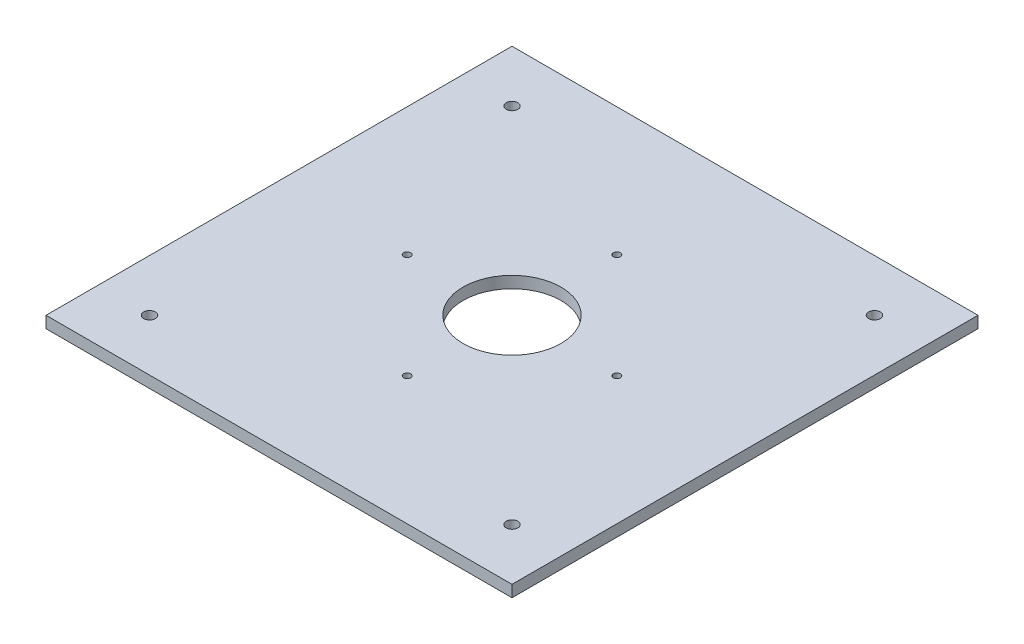
ISO-10303-21;
HEADER;
FILE_DESCRIPTION(('STEP AP214'),'2;1');
FILE_NAME('part.step','',(''),(''),'','','');
FILE_SCHEMA(('AUTOMOTIVE_DESIGN { 1 0 10303 214 1 1 1 1 }'));
ENDSEC;
DATA;
#1=APPLICATION_CONTEXT('core data for automotive mechanical design processes');
#2=APPLICATION_PROTOCOL_DEFINITION('international standard','automotive_design',2000,#1);
#3=PRODUCT_CONTEXT('',#1,'mechanical');
#4=PRODUCT('Part','Part','',(#3));
#5=PRODUCT_RELATED_PRODUCT_CATEGORY('part','',(#4));
#6=PRODUCT_DEFINITION_FORMATION('','',#4);
#7=PRODUCT_DEFINITION_CONTEXT('part definition',#1,'design');
#8=PRODUCT_DEFINITION('design','',#6,#7);
#9=PRODUCT_DEFINITION_SHAPE('','',#8);
#10=(LENGTH_UNIT() NAMED_UNIT(*) SI_UNIT(.MILLI.,.METRE.));
#11=(NAMED_UNIT(*) PLANE_ANGLE_UNIT() SI_UNIT($,.RADIAN.));
#12=(NAMED_UNIT(*) SI_UNIT($,.STERADIAN.) SOLID_ANGLE_UNIT());
#13=UNCERTAINTY_MEASURE_WITH_UNIT(LENGTH_MEASURE(1.E-05),#10,'distance_accuracy_value','');
#14=(GEOMETRIC_REPRESENTATION_CONTEXT(3) GLOBAL_UNCERTAINTY_ASSIGNED_CONTEXT((#13)) GLOBAL_UNIT_ASSIGNED_CONTEXT((#10,
#11,#12)) REPRESENTATION_CONTEXT('',''));
#15=CARTESIAN_POINT('',(0.,0.,0.));
#16=DIRECTION('',(0.,0.,1.));
#17=DIRECTION('',(1.,0.,0.));
#18=AXIS2_PLACEMENT_3D('',#15,#16,#17);
#19=CARTESIAN_POINT('',(99.9999999999999,5.,-100.));
#20=DIRECTION('',(-1.,0.,0.));
#21=DIRECTION('',(0.,0.,1.));
#22=AXIS2_PLACEMENT_3D('',#19,#20,#21);
#23=PLANE('',#22);
#24=DIRECTION('',(0.,0.,-1.));
#25=VECTOR('',#24,1.);
#26=CARTESIAN_POINT('',(99.9999999999999,0.,-100.));
#27=LINE('',#26,#25);
#28=CARTESIAN_POINT('',(100.,0.,100.));
#29=VERTEX_POINT('',#28);
#30=CARTESIAN_POINT('',(99.9999999999999,0.,-100.));
#31=VERTEX_POINT('',#30);
#32=EDGE_CURVE('E111',#29,#31,#27,.T.);
#33=ORIENTED_EDGE('',*,*,#32,.T.);
#34=DIRECTION('',(0.,-1.,0.));
#35=VECTOR('',#34,1.);
#36=CARTESIAN_POINT('',(99.9999999999999,5.,-100.));
#37=LINE('',#36,#35);
#38=CARTESIAN_POINT('',(99.9999999999999,5.,-100.));
#39=VERTEX_POINT('',#38);
#40=EDGE_CURVE('E11',#39,#31,#37,.T.);
#41=ORIENTED_EDGE('',*,*,#40,.F.);
#42=DIRECTION('',(0.,0.,-1.));
#43=VECTOR('',#42,1.);
#44=CARTESIAN_POINT('',(99.9999999999999,5.,-100.));
#45=LINE('',#44,#43);
#46=CARTESIAN_POINT('',(100.,5.,100.));
#47=VERTEX_POINT('',#46);
#48=EDGE_CURVE('E93',#47,#39,#45,.T.);
#49=ORIENTED_EDGE('',*,*,#48,.F.);
#50=DIRECTION('',(0.,-1.,0.));
#51=VECTOR('',#50,1.);
#52=CARTESIAN_POINT('',(100.,5.,100.));
#53=LINE('',#52,#51);
#54=EDGE_CURVE('E107',#47,#29,#53,.T.);
#55=ORIENTED_EDGE('',*,*,#54,.T.);
#56=EDGE_LOOP('',(#33,#41,#49,#55));
#57=FACE_BOUND('',#56,.T.);
#58=ADVANCED_FACE('F40',(#57),#23,.F.);
#59=CARTESIAN_POINT('',(-100.,5.,-100.));
#60=DIRECTION('',(0.,0.,1.));
#61=DIRECTION('',(1.,0.,0.));
#62=AXIS2_PLACEMENT_3D('',#59,#60,#61);
#63=PLANE('',#62);
#64=DIRECTION('',(-1.,0.,0.));
#65=VECTOR('',#64,1.);
#66=CARTESIAN_POINT('',(-100.,0.,-100.));
#67=LINE('',#66,#65);
#68=CARTESIAN_POINT('',(-100.,0.,-100.));
#69=VERTEX_POINT('',#68);
#70=EDGE_CURVE('E98',#31,#69,#67,.T.);
#71=ORIENTED_EDGE('',*,*,#70,.T.);
#72=DIRECTION('',(0.,-1.,0.));
#73=VECTOR('',#72,1.);
#74=CARTESIAN_POINT('',(-100.,5.,-100.));
#75=LINE('',#74,#73);
#76=CARTESIAN_POINT('',(-100.,5.,-100.));
#77=VERTEX_POINT('',#76);
#78=EDGE_CURVE('E50',#77,#69,#75,.T.);
#79=ORIENTED_EDGE('',*,*,#78,.F.);
#80=DIRECTION('',(-1.,0.,0.));
#81=VECTOR('',#80,1.);
#82=CARTESIAN_POINT('',(-100.,5.,-100.));
#83=LINE('',#82,#81);
#84=EDGE_CURVE('E88',#39,#77,#83,.T.);
#85=ORIENTED_EDGE('',*,*,#84,.F.);
#86=ORIENTED_EDGE('',*,*,#40,.T.);
#87=EDGE_LOOP('',(#71,#79,#85,#86));
#88=FACE_BOUND('',#87,.T.);
#89=ADVANCED_FACE('F97',(#88),#63,.F.);
#90=CARTESIAN_POINT('',(-100.,5.,-100.));
#91=DIRECTION('',(1.,0.,0.));
#92=DIRECTION('',(0.,0.,-1.));
#93=AXIS2_PLACEMENT_3D('',#90,#91,#92);
#94=PLANE('',#93);
#95=DIRECTION('',(0.,0.,1.));
#96=VECTOR('',#95,1.);
#97=CARTESIAN_POINT('',(-100.,0.,-100.));
#98=LINE('',#97,#96);
#99=CARTESIAN_POINT('',(-100.,0.,100.));
#100=VERTEX_POINT('',#99);
#101=EDGE_CURVE('E75',#69,#100,#98,.T.);
#102=ORIENTED_EDGE('',*,*,#101,.T.);
#103=DIRECTION('',(0.,-1.,0.));
#104=VECTOR('',#103,1.);
#105=CARTESIAN_POINT('',(-100.,5.,100.));
#106=LINE('',#105,#104);
#107=CARTESIAN_POINT('',(-100.,5.,100.));
#108=VERTEX_POINT('',#107);
#109=EDGE_CURVE('E100',#108,#100,#106,.T.);
#110=ORIENTED_EDGE('',*,*,#109,.F.);
#111=DIRECTION('',(0.,0.,1.));
#112=VECTOR('',#111,1.);
#113=CARTESIAN_POINT('',(-100.,5.,-100.));
#114=LINE('',#113,#112);
#115=EDGE_CURVE('E91',#77,#108,#114,.T.);
#116=ORIENTED_EDGE('',*,*,#115,.F.);
#117=ORIENTED_EDGE('',*,*,#78,.T.);
#118=EDGE_LOOP('',(#102,#110,#116,#117));
#119=FACE_BOUND('',#118,.T.);
#120=ADVANCED_FACE('F102',(#119),#94,.F.);
#121=CARTESIAN_POINT('',(-100.,5.,100.));
#122=DIRECTION('',(0.,0.,-1.));
#123=DIRECTION('',(-1.,0.,0.));
#124=AXIS2_PLACEMENT_3D('',#121,#122,#123);
#125=PLANE('',#124);
#126=DIRECTION('',(1.,0.,0.));
#127=VECTOR('',#126,1.);
#128=CARTESIAN_POINT('',(-100.,0.,100.));
#129=LINE('',#128,#127);
#130=EDGE_CURVE('E81',#100,#29,#129,.T.);
#131=ORIENTED_EDGE('',*,*,#130,.T.);
#132=ORIENTED_EDGE('',*,*,#54,.F.);
#133=DIRECTION('',(1.,0.,0.));
#134=VECTOR('',#133,1.);
#135=CARTESIAN_POINT('',(-100.,5.,100.));
#136=LINE('',#135,#134);
#137=EDGE_CURVE('E58',#108,#47,#136,.T.);
#138=ORIENTED_EDGE('',*,*,#137,.F.);
#139=ORIENTED_EDGE('',*,*,#109,.T.);
#140=EDGE_LOOP('',(#131,#132,#138,#139));
#141=FACE_BOUND('',#140,.T.);
#142=ADVANCED_FACE('F126',(#141),#125,.F.);
#143=CARTESIAN_POINT('',(0.,5.,0.));
#144=DIRECTION('',(0.,1.,0.));
#145=DIRECTION('',(0.,0.,1.));
#146=AXIS2_PLACEMENT_3D('',#143,#144,#145);
#147=PLANE('',#146);
#148=CARTESIAN_POINT('',(0.,5.,0.));
#149=DIRECTION('',(0.,1.,0.));
#150=DIRECTION('',(0.,0.,1.));
#151=AXIS2_PLACEMENT_3D('',#148,#149,#150);
#152=CIRCLE('',#151,21.);
#153=CARTESIAN_POINT('',(0.,5.,21.));
#154=VERTEX_POINT('',#153);
#155=EDGE_CURVE('E197',#154,#154,#152,.T.);
#156=ORIENTED_EDGE('',*,*,#155,.F.);
#157=EDGE_LOOP('',(#156));
#158=FACE_BOUND('',#157,.T.);
#159=CARTESIAN_POINT('',(0.,5.,45.));
#160=DIRECTION('',(0.,1.,0.));
#161=DIRECTION('',(0.,0.,1.));
#162=AXIS2_PLACEMENT_3D('',#159,#160,#161);
#163=CIRCLE('',#162,1.5);
#164=CARTESIAN_POINT('',(0.,5.,46.5));
#165=VERTEX_POINT('',#164);
#166=EDGE_CURVE('E190',#165,#165,#163,.T.);
#167=ORIENTED_EDGE('',*,*,#166,.F.);
#168=EDGE_LOOP('',(#167));
#169=FACE_BOUND('',#168,.T.);
#170=CARTESIAN_POINT('',(-45.,5.,0.));
#171=DIRECTION('',(0.,1.,0.));
#172=DIRECTION('',(0.,0.,1.));
#173=AXIS2_PLACEMENT_3D('',#170,#171,#172);
#174=CIRCLE('',#173,1.5);
#175=CARTESIAN_POINT('',(-45.,5.,1.5));
#176=VERTEX_POINT('',#175);
#177=EDGE_CURVE('E182',#176,#176,#174,.T.);
#178=ORIENTED_EDGE('',*,*,#177,.F.);
#179=EDGE_LOOP('',(#178));
#180=FACE_BOUND('',#179,.T.);
#181=CARTESIAN_POINT('',(0.,5.,-45.));
#182=DIRECTION('',(0.,1.,0.));
#183=DIRECTION('',(0.,0.,1.));
#184=AXIS2_PLACEMENT_3D('',#181,#182,#183);
#185=CIRCLE('',#184,1.5);
#186=CARTESIAN_POINT('',(0.,5.,-43.5));
#187=VERTEX_POINT('',#186);
#188=EDGE_CURVE('E174',#187,#187,#185,.T.);
#189=ORIENTED_EDGE('',*,*,#188,.F.);
#190=EDGE_LOOP('',(#189));
#191=FACE_BOUND('',#190,.T.);
#192=CARTESIAN_POINT('',(45.,5.,0.));
#193=DIRECTION('',(0.,1.,0.));
#194=DIRECTION('',(0.,0.,1.));
#195=AXIS2_PLACEMENT_3D('',#192,#193,#194);
#196=CIRCLE('',#195,1.5);
#197=CARTESIAN_POINT('',(45.,5.,1.5));
#198=VERTEX_POINT('',#197);
#199=EDGE_CURVE('E166',#198,#198,#196,.T.);
#200=ORIENTED_EDGE('',*,*,#199,.F.);
#201=EDGE_LOOP('',(#200));
#202=FACE_BOUND('',#201,.T.);
#203=CARTESIAN_POINT('',(-77.7817459305203,5.,-77.7817459305181));
#204=DIRECTION('',(0.,1.,0.));
#205=DIRECTION('',(0.,0.,1.));
#206=AXIS2_PLACEMENT_3D('',#203,#204,#205);
#207=CIRCLE('',#206,2.50000000000001);
#208=CARTESIAN_POINT('',(-77.7817459305203,5.,-75.2817459305181));
#209=VERTEX_POINT('',#208);
#210=EDGE_CURVE('E142',#209,#209,#207,.T.);
#211=ORIENTED_EDGE('',*,*,#210,.F.);
#212=EDGE_LOOP('',(#211));
#213=FACE_BOUND('',#212,.T.);
#214=CARTESIAN_POINT('',(-77.7817459305181,5.,77.7817459305224));
#215=DIRECTION('',(0.,1.,0.));
#216=DIRECTION('',(0.,0.,1.));
#217=AXIS2_PLACEMENT_3D('',#214,#215,#216);
#218=CIRCLE('',#217,2.5);
#219=CARTESIAN_POINT('',(-77.7817459305181,5.,80.2817459305224));
#220=VERTEX_POINT('',#219);
#221=EDGE_CURVE('E151',#220,#220,#218,.T.);
#222=ORIENTED_EDGE('',*,*,#221,.F.);
#223=EDGE_LOOP('',(#222));
#224=FACE_BOUND('',#223,.T.);
#225=CARTESIAN_POINT('',(77.7817459305224,5.,77.7817459305202));
#226=DIRECTION('',(0.,1.,0.));
#227=DIRECTION('',(0.,0.,1.));
#228=AXIS2_PLACEMENT_3D('',#225,#226,#227);
#229=CIRCLE('',#228,2.5);
#230=CARTESIAN_POINT('',(77.7817459305224,5.,80.2817459305202));
#231=VERTEX_POINT('',#230);
#232=EDGE_CURVE('E159',#231,#231,#229,.T.);
#233=ORIENTED_EDGE('',*,*,#232,.F.);
#234=EDGE_LOOP('',(#233));
#235=FACE_BOUND('',#234,.T.);
#236=CARTESIAN_POINT('',(77.7817459305202,5.,-77.7817459305203));
#237=DIRECTION('',(0.,1.,0.));
#238=DIRECTION('',(0.,0.,1.));
#239=AXIS2_PLACEMENT_3D('',#236,#237,#238);
#240=CIRCLE('',#239,2.50000000000001);
#241=CARTESIAN_POINT('',(77.7817459305202,5.,-75.2817459305203));
#242=VERTEX_POINT('',#241);
#243=EDGE_CURVE('E134',#242,#242,#240,.T.);
#244=ORIENTED_EDGE('',*,*,#243,.F.);
#245=EDGE_LOOP('',(#244));
#246=FACE_BOUND('',#245,.T.);
#247=ORIENTED_EDGE('',*,*,#48,.T.);
#248=ORIENTED_EDGE('',*,*,#84,.T.);
#249=ORIENTED_EDGE('',*,*,#115,.T.);
#250=ORIENTED_EDGE('',*,*,#137,.T.);
#251=EDGE_LOOP('',(#247,#248,#249,#250));
#252=FACE_BOUND('',#251,.T.);
#253=ADVANCED_FACE('F89',(#158,#169,#180,#191,#202,#213,#224,#235,#246,#252),#147,.T.);
#254=CARTESIAN_POINT('',(0.,0.,0.));
#255=DIRECTION('',(0.,1.,0.));
#256=DIRECTION('',(0.,0.,1.));
#257=AXIS2_PLACEMENT_3D('',#254,#255,#256);
#258=PLANE('',#257);
#259=CARTESIAN_POINT('',(0.,0.,0.));
#260=DIRECTION('',(0.,1.,0.));
#261=DIRECTION('',(0.,0.,1.));
#262=AXIS2_PLACEMENT_3D('',#259,#260,#261);
#263=CIRCLE('',#262,21.);
#264=CARTESIAN_POINT('',(0.,0.,21.));
#265=VERTEX_POINT('',#264);
#266=EDGE_CURVE('E43',#265,#265,#263,.T.);
#267=ORIENTED_EDGE('',*,*,#266,.T.);
#268=EDGE_LOOP('',(#267));
#269=FACE_BOUND('',#268,.T.);
#270=CARTESIAN_POINT('',(0.,0.,45.));
#271=DIRECTION('',(0.,1.,0.));
#272=DIRECTION('',(0.,0.,1.));
#273=AXIS2_PLACEMENT_3D('',#270,#271,#272);
#274=CIRCLE('',#273,1.5);
#275=CARTESIAN_POINT('',(0.,0.,46.5));
#276=VERTEX_POINT('',#275);
#277=EDGE_CURVE('E147',#276,#276,#274,.T.);
#278=ORIENTED_EDGE('',*,*,#277,.T.);
#279=EDGE_LOOP('',(#278));
#280=FACE_BOUND('',#279,.T.);
#281=CARTESIAN_POINT('',(-45.,0.,0.));
#282=DIRECTION('',(0.,1.,0.));
#283=DIRECTION('',(0.,0.,1.));
#284=AXIS2_PLACEMENT_3D('',#281,#282,#283);
#285=CIRCLE('',#284,1.5);
#286=CARTESIAN_POINT('',(-45.,0.,1.5));
#287=VERTEX_POINT('',#286);
#288=EDGE_CURVE('E186',#287,#287,#285,.T.);
#289=ORIENTED_EDGE('',*,*,#288,.T.);
#290=EDGE_LOOP('',(#289));
#291=FACE_BOUND('',#290,.T.);
#292=CARTESIAN_POINT('',(0.,0.,-45.));
#293=DIRECTION('',(0.,1.,0.));
#294=DIRECTION('',(0.,0.,1.));
#295=AXIS2_PLACEMENT_3D('',#292,#293,#294);
#296=CIRCLE('',#295,1.5);
#297=CARTESIAN_POINT('',(0.,0.,-43.5));
#298=VERTEX_POINT('',#297);
#299=EDGE_CURVE('E178',#298,#298,#296,.T.);
#300=ORIENTED_EDGE('',*,*,#299,.T.);
#301=EDGE_LOOP('',(#300));
#302=FACE_BOUND('',#301,.T.);
#303=CARTESIAN_POINT('',(45.,0.,0.));
#304=DIRECTION('',(0.,1.,0.));
#305=DIRECTION('',(0.,0.,1.));
#306=AXIS2_PLACEMENT_3D('',#303,#304,#305);
#307=CIRCLE('',#306,1.5);
#308=CARTESIAN_POINT('',(45.,0.,1.5));
#309=VERTEX_POINT('',#308);
#310=EDGE_CURVE('E170',#309,#309,#307,.T.);
#311=ORIENTED_EDGE('',*,*,#310,.T.);
#312=EDGE_LOOP('',(#311));
#313=FACE_BOUND('',#312,.T.);
#314=CARTESIAN_POINT('',(-77.7817459305203,0.,-77.7817459305181));
#315=DIRECTION('',(0.,1.,0.));
#316=DIRECTION('',(0.,0.,1.));
#317=AXIS2_PLACEMENT_3D('',#314,#315,#316);
#318=CIRCLE('',#317,2.50000000000001);
#319=CARTESIAN_POINT('',(-77.7817459305203,0.,-75.2817459305181));
#320=VERTEX_POINT('',#319);
#321=EDGE_CURVE('E146',#320,#320,#318,.T.);
#322=ORIENTED_EDGE('',*,*,#321,.T.);
#323=EDGE_LOOP('',(#322));
#324=FACE_BOUND('',#323,.T.);
#325=CARTESIAN_POINT('',(-77.7817459305181,0.,77.7817459305224));
#326=DIRECTION('',(0.,1.,0.));
#327=DIRECTION('',(0.,0.,1.));
#328=AXIS2_PLACEMENT_3D('',#325,#326,#327);
#329=CIRCLE('',#328,2.5);
#330=CARTESIAN_POINT('',(-77.7817459305181,0.,80.2817459305224));
#331=VERTEX_POINT('',#330);
#332=EDGE_CURVE('E155',#331,#331,#329,.T.);
#333=ORIENTED_EDGE('',*,*,#332,.T.);
#334=EDGE_LOOP('',(#333));
#335=FACE_BOUND('',#334,.T.);
#336=CARTESIAN_POINT('',(77.7817459305224,0.,77.7817459305202));
#337=DIRECTION('',(0.,1.,0.));
#338=DIRECTION('',(0.,0.,1.));
#339=AXIS2_PLACEMENT_3D('',#336,#337,#338);
#340=CIRCLE('',#339,2.5);
#341=CARTESIAN_POINT('',(77.7817459305224,0.,80.2817459305202));
#342=VERTEX_POINT('',#341);
#343=EDGE_CURVE('E138',#342,#342,#340,.T.);
#344=ORIENTED_EDGE('',*,*,#343,.T.);
#345=EDGE_LOOP('',(#344));
#346=FACE_BOUND('',#345,.T.);
#347=CARTESIAN_POINT('',(77.7817459305202,0.,-77.7817459305203));
#348=DIRECTION('',(0.,1.,0.));
#349=DIRECTION('',(0.,0.,1.));
#350=AXIS2_PLACEMENT_3D('',#347,#348,#349);
#351=CIRCLE('',#350,2.50000000000001);
#352=CARTESIAN_POINT('',(77.7817459305202,0.,-75.2817459305203));
#353=VERTEX_POINT('',#352);
#354=EDGE_CURVE('E115',#353,#353,#351,.T.);
#355=ORIENTED_EDGE('',*,*,#354,.T.);
#356=EDGE_LOOP('',(#355));
#357=FACE_BOUND('',#356,.T.);
#358=ORIENTED_EDGE('',*,*,#32,.F.);
#359=ORIENTED_EDGE('',*,*,#130,.F.);
#360=ORIENTED_EDGE('',*,*,#101,.F.);
#361=ORIENTED_EDGE('',*,*,#70,.F.);
#362=EDGE_LOOP('',(#358,#359,#360,#361));
#363=FACE_BOUND('',#362,.T.);
#364=ADVANCED_FACE('F129',(#269,#280,#291,#302,#313,#324,#335,#346,#357,#363),#258,.F.);
#365=CARTESIAN_POINT('',(77.7817459305202,0.,-77.7817459305203));
#366=DIRECTION('',(0.,1.,0.));
#367=DIRECTION('',(0.,0.,1.));
#368=AXIS2_PLACEMENT_3D('',#365,#366,#367);
#369=CYLINDRICAL_SURFACE('',#368,2.50000000000001);
#370=ORIENTED_EDGE('',*,*,#354,.F.);
#371=EDGE_LOOP('',(#370));
#372=FACE_BOUND('',#371,.T.);
#373=ORIENTED_EDGE('',*,*,#243,.T.);
#374=EDGE_LOOP('',(#373));
#375=FACE_BOUND('',#374,.T.);
#376=ADVANCED_FACE('F233',(#372,#375),#369,.F.);
#377=CARTESIAN_POINT('',(77.7817459305224,0.,77.7817459305202));
#378=DIRECTION('',(0.,1.,0.));
#379=DIRECTION('',(0.,0.,1.));
#380=AXIS2_PLACEMENT_3D('',#377,#378,#379);
#381=CYLINDRICAL_SURFACE('',#380,2.5);
#382=ORIENTED_EDGE('',*,*,#343,.F.);
#383=EDGE_LOOP('',(#382));
#384=FACE_BOUND('',#383,.T.);
#385=ORIENTED_EDGE('',*,*,#232,.T.);
#386=EDGE_LOOP('',(#385));
#387=FACE_BOUND('',#386,.T.);
#388=ADVANCED_FACE('F239',(#384,#387),#381,.F.);
#389=CARTESIAN_POINT('',(-77.7817459305181,0.,77.7817459305224));
#390=DIRECTION('',(0.,1.,0.));
#391=DIRECTION('',(0.,0.,1.));
#392=AXIS2_PLACEMENT_3D('',#389,#390,#391);
#393=CYLINDRICAL_SURFACE('',#392,2.5);
#394=ORIENTED_EDGE('',*,*,#332,.F.);
#395=EDGE_LOOP('',(#394));
#396=FACE_BOUND('',#395,.T.);
#397=ORIENTED_EDGE('',*,*,#221,.T.);
#398=EDGE_LOOP('',(#397));
#399=FACE_BOUND('',#398,.T.);
#400=ADVANCED_FACE('F245',(#396,#399),#393,.F.);
#401=CARTESIAN_POINT('',(-77.7817459305203,0.,-77.7817459305181));
#402=DIRECTION('',(0.,1.,0.));
#403=DIRECTION('',(0.,0.,1.));
#404=AXIS2_PLACEMENT_3D('',#401,#402,#403);
#405=CYLINDRICAL_SURFACE('',#404,2.50000000000001);
#406=ORIENTED_EDGE('',*,*,#321,.F.);
#407=EDGE_LOOP('',(#406));
#408=FACE_BOUND('',#407,.T.);
#409=ORIENTED_EDGE('',*,*,#210,.T.);
#410=EDGE_LOOP('',(#409));
#411=FACE_BOUND('',#410,.T.);
#412=ADVANCED_FACE('F241',(#408,#411),#405,.F.);
#413=CARTESIAN_POINT('',(45.,0.,0.));
#414=DIRECTION('',(0.,1.,0.));
#415=DIRECTION('',(0.,0.,1.));
#416=AXIS2_PLACEMENT_3D('',#413,#414,#415);
#417=CYLINDRICAL_SURFACE('',#416,1.5);
#418=ORIENTED_EDGE('',*,*,#310,.F.);
#419=EDGE_LOOP('',(#418));
#420=FACE_BOUND('',#419,.T.);
#421=ORIENTED_EDGE('',*,*,#199,.T.);
#422=EDGE_LOOP('',(#421));
#423=FACE_BOUND('',#422,.T.);
#424=ADVANCED_FACE('F244',(#420,#423),#417,.F.);
#425=CARTESIAN_POINT('',(0.,0.,-45.));
#426=DIRECTION('',(0.,1.,0.));
#427=DIRECTION('',(0.,0.,1.));
#428=AXIS2_PLACEMENT_3D('',#425,#426,#427);
#429=CYLINDRICAL_SURFACE('',#428,1.5);
#430=ORIENTED_EDGE('',*,*,#299,.F.);
#431=EDGE_LOOP('',(#430));
#432=FACE_BOUND('',#431,.T.);
#433=ORIENTED_EDGE('',*,*,#188,.T.);
#434=EDGE_LOOP('',(#433));
#435=FACE_BOUND('',#434,.T.);
#436=ADVANCED_FACE('F255',(#432,#435),#429,.F.);
#437=CARTESIAN_POINT('',(-45.,0.,0.));
#438=DIRECTION('',(0.,1.,0.));
#439=DIRECTION('',(0.,0.,1.));
#440=AXIS2_PLACEMENT_3D('',#437,#438,#439);
#441=CYLINDRICAL_SURFACE('',#440,1.5);
#442=ORIENTED_EDGE('',*,*,#288,.F.);
#443=EDGE_LOOP('',(#442));
#444=FACE_BOUND('',#443,.T.);
#445=ORIENTED_EDGE('',*,*,#177,.T.);
#446=EDGE_LOOP('',(#445));
#447=FACE_BOUND('',#446,.T.);
#448=ADVANCED_FACE('F217',(#444,#447),#441,.F.);
#449=CARTESIAN_POINT('',(0.,0.,45.));
#450=DIRECTION('',(0.,1.,0.));
#451=DIRECTION('',(0.,0.,1.));
#452=AXIS2_PLACEMENT_3D('',#449,#450,#451);
#453=CYLINDRICAL_SURFACE('',#452,1.5);
#454=ORIENTED_EDGE('',*,*,#277,.F.);
#455=EDGE_LOOP('',(#454));
#456=FACE_BOUND('',#455,.T.);
#457=ORIENTED_EDGE('',*,*,#166,.T.);
#458=EDGE_LOOP('',(#457));
#459=FACE_BOUND('',#458,.T.);
#460=ADVANCED_FACE('F212',(#456,#459),#453,.F.);
#461=CARTESIAN_POINT('',(0.,-1.99999999999999,0.));
#462=DIRECTION('',(0.,1.,0.));
#463=DIRECTION('',(0.,0.,1.));
#464=AXIS2_PLACEMENT_3D('',#461,#462,#463);
#465=CYLINDRICAL_SURFACE('',#464,21.);
#466=ORIENTED_EDGE('',*,*,#155,.T.);
#467=EDGE_LOOP('',(#466));
#468=FACE_BOUND('',#467,.T.);
#469=ORIENTED_EDGE('',*,*,#266,.F.);
#470=EDGE_LOOP('',(#469));
#471=FACE_BOUND('',#470,.T.);
#472=ADVANCED_FACE('F210',(#468,#471),#465,.F.);
#473=CLOSED_SHELL('',(#58,#89,#120,#142,#253,#364,#376,#388,#400,#412,#424,#436,#448,#460,#472));
#474=MANIFOLD_SOLID_BREP('B2',#473);
#475=ADVANCED_BREP_SHAPE_REPRESENTATION('',(#18,#474),#14);
#476=SHAPE_DEFINITION_REPRESENTATION(#9,#475);
ENDSEC;
END-ISO-10303-21;
